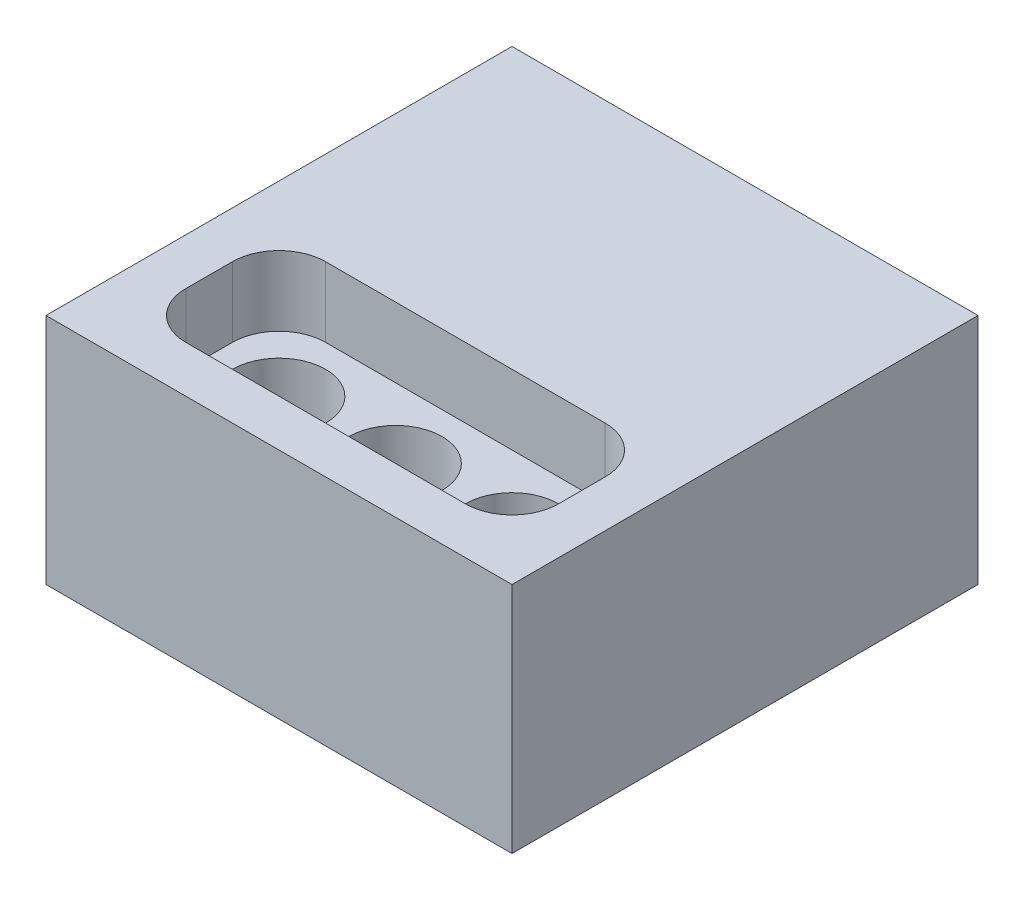
ISO-10303-21;
HEADER;
FILE_DESCRIPTION(('STEP AP214'),'2;1');
FILE_NAME('part.step','',(''),(''),'','','');
FILE_SCHEMA(('AUTOMOTIVE_DESIGN { 1 0 10303 214 1 1 1 1 }'));
ENDSEC;
DATA;
#1=APPLICATION_CONTEXT('core data for automotive mechanical design processes');
#2=APPLICATION_PROTOCOL_DEFINITION('international standard','automotive_design',2000,#1);
#3=PRODUCT_CONTEXT('',#1,'mechanical');
#4=PRODUCT('Part','Part','',(#3));
#5=PRODUCT_RELATED_PRODUCT_CATEGORY('part','',(#4));
#6=PRODUCT_DEFINITION_FORMATION('','',#4);
#7=PRODUCT_DEFINITION_CONTEXT('part definition',#1,'design');
#8=PRODUCT_DEFINITION('design','',#6,#7);
#9=PRODUCT_DEFINITION_SHAPE('','',#8);
#10=(LENGTH_UNIT() NAMED_UNIT(*) SI_UNIT(.MILLI.,.METRE.));
#11=(NAMED_UNIT(*) PLANE_ANGLE_UNIT() SI_UNIT($,.RADIAN.));
#12=(NAMED_UNIT(*) SI_UNIT($,.STERADIAN.) SOLID_ANGLE_UNIT());
#13=UNCERTAINTY_MEASURE_WITH_UNIT(LENGTH_MEASURE(1.E-05),#10,'distance_accuracy_value','');
#14=(GEOMETRIC_REPRESENTATION_CONTEXT(3) GLOBAL_UNCERTAINTY_ASSIGNED_CONTEXT((#13)) GLOBAL_UNIT_ASSIGNED_CONTEXT((#10,
#11,#12)) REPRESENTATION_CONTEXT('',''));
#15=CARTESIAN_POINT('',(0.,0.,0.));
#16=DIRECTION('',(0.,0.,1.));
#17=DIRECTION('',(1.,0.,0.));
#18=AXIS2_PLACEMENT_3D('',#15,#16,#17);
#19=CARTESIAN_POINT('',(0.,50.,0.));
#20=DIRECTION('',(1.,0.,0.));
#21=DIRECTION('',(0.,0.,-1.));
#22=AXIS2_PLACEMENT_3D('',#19,#20,#21);
#23=PLANE('',#22);
#24=DIRECTION('',(0.,0.,1.));
#25=VECTOR('',#24,1.);
#26=CARTESIAN_POINT('',(0.,0.,0.));
#27=LINE('',#26,#25);
#28=CARTESIAN_POINT('',(0.,0.,-100.));
#29=VERTEX_POINT('',#28);
#30=CARTESIAN_POINT('',(0.,0.,0.));
#31=VERTEX_POINT('',#30);
#32=EDGE_CURVE('E143',#29,#31,#27,.T.);
#33=ORIENTED_EDGE('',*,*,#32,.T.);
#34=DIRECTION('',(0.,-1.,0.));
#35=VECTOR('',#34,1.);
#36=CARTESIAN_POINT('',(0.,50.,0.));
#37=LINE('',#36,#35);
#38=CARTESIAN_POINT('',(0.,50.,0.));
#39=VERTEX_POINT('',#38);
#40=EDGE_CURVE('E124',#39,#31,#37,.T.);
#41=ORIENTED_EDGE('',*,*,#40,.F.);
#42=DIRECTION('',(0.,0.,1.));
#43=VECTOR('',#42,1.);
#44=CARTESIAN_POINT('',(0.,50.,0.));
#45=LINE('',#44,#43);
#46=CARTESIAN_POINT('',(0.,50.,-100.));
#47=VERTEX_POINT('',#46);
#48=EDGE_CURVE('E131',#47,#39,#45,.T.);
#49=ORIENTED_EDGE('',*,*,#48,.F.);
#50=DIRECTION('',(0.,-1.,0.));
#51=VECTOR('',#50,1.);
#52=CARTESIAN_POINT('',(0.,50.,-100.));
#53=LINE('',#52,#51);
#54=EDGE_CURVE('E223',#47,#29,#53,.T.);
#55=ORIENTED_EDGE('',*,*,#54,.T.);
#56=EDGE_LOOP('',(#33,#41,#49,#55));
#57=FACE_BOUND('',#56,.T.);
#58=ADVANCED_FACE('F32',(#57),#23,.F.);
#59=CARTESIAN_POINT('',(0.,50.,0.));
#60=DIRECTION('',(0.,0.,-1.));
#61=DIRECTION('',(-1.,0.,0.));
#62=AXIS2_PLACEMENT_3D('',#59,#60,#61);
#63=PLANE('',#62);
#64=DIRECTION('',(1.,0.,0.));
#65=VECTOR('',#64,1.);
#66=CARTESIAN_POINT('',(0.,0.,0.));
#67=LINE('',#66,#65);
#68=CARTESIAN_POINT('',(100.,0.,0.));
#69=VERTEX_POINT('',#68);
#70=EDGE_CURVE('E225',#31,#69,#67,.T.);
#71=ORIENTED_EDGE('',*,*,#70,.T.);
#72=DIRECTION('',(0.,-1.,0.));
#73=VECTOR('',#72,1.);
#74=CARTESIAN_POINT('',(100.,50.,0.));
#75=LINE('',#74,#73);
#76=CARTESIAN_POINT('',(100.,50.,0.));
#77=VERTEX_POINT('',#76);
#78=EDGE_CURVE('E127',#77,#69,#75,.T.);
#79=ORIENTED_EDGE('',*,*,#78,.F.);
#80=DIRECTION('',(1.,0.,0.));
#81=VECTOR('',#80,1.);
#82=CARTESIAN_POINT('',(0.,50.,0.));
#83=LINE('',#82,#81);
#84=EDGE_CURVE('E120',#39,#77,#83,.T.);
#85=ORIENTED_EDGE('',*,*,#84,.F.);
#86=ORIENTED_EDGE('',*,*,#40,.T.);
#87=EDGE_LOOP('',(#71,#79,#85,#86));
#88=FACE_BOUND('',#87,.T.);
#89=ADVANCED_FACE('F122',(#88),#63,.F.);
#90=CARTESIAN_POINT('',(100.,50.,0.));
#91=DIRECTION('',(-1.,0.,0.));
#92=DIRECTION('',(0.,0.,1.));
#93=AXIS2_PLACEMENT_3D('',#90,#91,#92);
#94=PLANE('',#93);
#95=DIRECTION('',(0.,0.,-1.));
#96=VECTOR('',#95,1.);
#97=CARTESIAN_POINT('',(100.,0.,0.));
#98=LINE('',#97,#96);
#99=CARTESIAN_POINT('',(100.,0.,-100.));
#100=VERTEX_POINT('',#99);
#101=EDGE_CURVE('E227',#69,#100,#98,.T.);
#102=ORIENTED_EDGE('',*,*,#101,.T.);
#103=DIRECTION('',(0.,-1.,0.));
#104=VECTOR('',#103,1.);
#105=CARTESIAN_POINT('',(100.,50.,-100.));
#106=LINE('',#105,#104);
#107=CARTESIAN_POINT('',(100.,50.,-100.));
#108=VERTEX_POINT('',#107);
#109=EDGE_CURVE('E148',#108,#100,#106,.T.);
#110=ORIENTED_EDGE('',*,*,#109,.F.);
#111=DIRECTION('',(0.,0.,-1.));
#112=VECTOR('',#111,1.);
#113=CARTESIAN_POINT('',(100.,50.,0.));
#114=LINE('',#113,#112);
#115=EDGE_CURVE('E130',#77,#108,#114,.T.);
#116=ORIENTED_EDGE('',*,*,#115,.F.);
#117=ORIENTED_EDGE('',*,*,#78,.T.);
#118=EDGE_LOOP('',(#102,#110,#116,#117));
#119=FACE_BOUND('',#118,.T.);
#120=ADVANCED_FACE('F239',(#119),#94,.F.);
#121=CARTESIAN_POINT('',(0.,50.,-100.));
#122=DIRECTION('',(0.,0.,1.));
#123=DIRECTION('',(1.,0.,0.));
#124=AXIS2_PLACEMENT_3D('',#121,#122,#123);
#125=PLANE('',#124);
#126=DIRECTION('',(-1.,0.,0.));
#127=VECTOR('',#126,1.);
#128=CARTESIAN_POINT('',(0.,0.,-100.));
#129=LINE('',#128,#127);
#130=EDGE_CURVE('E140',#100,#29,#129,.T.);
#131=ORIENTED_EDGE('',*,*,#130,.T.);
#132=ORIENTED_EDGE('',*,*,#54,.F.);
#133=DIRECTION('',(-1.,0.,0.));
#134=VECTOR('',#133,1.);
#135=CARTESIAN_POINT('',(0.,50.,-100.));
#136=LINE('',#135,#134);
#137=EDGE_CURVE('E136',#108,#47,#136,.T.);
#138=ORIENTED_EDGE('',*,*,#137,.F.);
#139=ORIENTED_EDGE('',*,*,#109,.T.);
#140=EDGE_LOOP('',(#131,#132,#138,#139));
#141=FACE_BOUND('',#140,.T.);
#142=ADVANCED_FACE('F234',(#141),#125,.F.);
#143=CARTESIAN_POINT('',(0.,50.,0.));
#144=DIRECTION('',(0.,-1.,0.));
#145=DIRECTION('',(0.,0.,-1.));
#146=AXIS2_PLACEMENT_3D('',#143,#144,#145);
#147=PLANE('',#146);
#148=DIRECTION('',(1.,0.,0.));
#149=VECTOR('',#148,1.);
#150=CARTESIAN_POINT('',(10.,50.,-10.));
#151=LINE('',#150,#149);
#152=CARTESIAN_POINT('',(20.,50.,-10.));
#153=VERTEX_POINT('',#152);
#154=CARTESIAN_POINT('',(80.,50.,-10.));
#155=VERTEX_POINT('',#154);
#156=EDGE_CURVE('E215',#153,#155,#151,.T.);
#157=ORIENTED_EDGE('',*,*,#156,.F.);
#158=CARTESIAN_POINT('',(20.,50.,-20.));
#159=DIRECTION('',(0.,-1.,0.));
#160=DIRECTION('',(0.,0.,-1.));
#161=AXIS2_PLACEMENT_3D('',#158,#159,#160);
#162=CIRCLE('',#161,10.);
#163=CARTESIAN_POINT('',(10.,50.,-20.));
#164=VERTEX_POINT('',#163);
#165=EDGE_CURVE('E11',#153,#164,#162,.T.);
#166=ORIENTED_EDGE('',*,*,#165,.T.);
#167=DIRECTION('',(0.,0.,1.));
#168=VECTOR('',#167,1.);
#169=CARTESIAN_POINT('',(10.,50.,-10.));
#170=LINE('',#169,#168);
#171=CARTESIAN_POINT('',(10.,50.,-30.));
#172=VERTEX_POINT('',#171);
#173=EDGE_CURVE('E182',#172,#164,#170,.T.);
#174=ORIENTED_EDGE('',*,*,#173,.F.);
#175=CARTESIAN_POINT('',(20.,50.,-30.));
#176=DIRECTION('',(0.,-1.,0.));
#177=DIRECTION('',(0.,0.,-1.));
#178=AXIS2_PLACEMENT_3D('',#175,#176,#177);
#179=CIRCLE('',#178,10.);
#180=CARTESIAN_POINT('',(20.,50.,-40.));
#181=VERTEX_POINT('',#180);
#182=EDGE_CURVE('E40',#172,#181,#179,.T.);
#183=ORIENTED_EDGE('',*,*,#182,.T.);
#184=DIRECTION('',(-1.,0.,0.));
#185=VECTOR('',#184,1.);
#186=CARTESIAN_POINT('',(10.,50.,-40.));
#187=LINE('',#186,#185);
#188=CARTESIAN_POINT('',(80.,50.,-40.));
#189=VERTEX_POINT('',#188);
#190=EDGE_CURVE('E181',#189,#181,#187,.T.);
#191=ORIENTED_EDGE('',*,*,#190,.F.);
#192=CARTESIAN_POINT('',(80.,50.,-30.));
#193=DIRECTION('',(0.,-1.,0.));
#194=DIRECTION('',(0.,0.,-1.));
#195=AXIS2_PLACEMENT_3D('',#192,#193,#194);
#196=CIRCLE('',#195,10.);
#197=CARTESIAN_POINT('',(90.,50.,-30.));
#198=VERTEX_POINT('',#197);
#199=EDGE_CURVE('E178',#189,#198,#196,.T.);
#200=ORIENTED_EDGE('',*,*,#199,.T.);
#201=DIRECTION('',(0.,0.,-1.));
#202=VECTOR('',#201,1.);
#203=CARTESIAN_POINT('',(90.,50.,-10.));
#204=LINE('',#203,#202);
#205=CARTESIAN_POINT('',(90.,50.,-20.));
#206=VERTEX_POINT('',#205);
#207=EDGE_CURVE('E189',#206,#198,#204,.T.);
#208=ORIENTED_EDGE('',*,*,#207,.F.);
#209=CARTESIAN_POINT('',(80.,50.,-20.));
#210=DIRECTION('',(0.,-1.,0.));
#211=DIRECTION('',(0.,0.,-1.));
#212=AXIS2_PLACEMENT_3D('',#209,#210,#211);
#213=CIRCLE('',#212,10.);
#214=EDGE_CURVE('E176',#206,#155,#213,.T.);
#215=ORIENTED_EDGE('',*,*,#214,.T.);
#216=EDGE_LOOP('',(#157,#166,#174,#183,#191,#200,#208,#215));
#217=FACE_BOUND('',#216,.T.);
#218=ORIENTED_EDGE('',*,*,#48,.T.);
#219=ORIENTED_EDGE('',*,*,#84,.T.);
#220=ORIENTED_EDGE('',*,*,#115,.T.);
#221=ORIENTED_EDGE('',*,*,#137,.T.);
#222=EDGE_LOOP('',(#218,#219,#220,#221));
#223=FACE_BOUND('',#222,.T.);
#224=ADVANCED_FACE('F134',(#217,#223),#147,.F.);
#225=CARTESIAN_POINT('',(0.,0.,0.));
#226=DIRECTION('',(0.,-1.,0.));
#227=DIRECTION('',(0.,0.,-1.));
#228=AXIS2_PLACEMENT_3D('',#225,#226,#227);
#229=PLANE('',#228);
#230=CARTESIAN_POINT('',(50.,0.,-25.));
#231=DIRECTION('',(0.,1.,0.));
#232=DIRECTION('',(0.,0.,1.));
#233=AXIS2_PLACEMENT_3D('',#230,#231,#232);
#234=CIRCLE('',#233,10.);
#235=CARTESIAN_POINT('',(50.,0.,-15.));
#236=VERTEX_POINT('',#235);
#237=EDGE_CURVE('E305',#236,#236,#234,.T.);
#238=ORIENTED_EDGE('',*,*,#237,.T.);
#239=EDGE_LOOP('',(#238));
#240=FACE_BOUND('',#239,.T.);
#241=ORIENTED_EDGE('',*,*,#32,.F.);
#242=ORIENTED_EDGE('',*,*,#130,.F.);
#243=ORIENTED_EDGE('',*,*,#101,.F.);
#244=ORIENTED_EDGE('',*,*,#70,.F.);
#245=EDGE_LOOP('',(#241,#242,#243,#244));
#246=FACE_BOUND('',#245,.T.);
#247=ADVANCED_FACE('F238',(#240,#246),#229,.T.);
#248=CARTESIAN_POINT('',(10.,35.,-10.));
#249=DIRECTION('',(-1.,0.,0.));
#250=DIRECTION('',(0.,0.,1.));
#251=AXIS2_PLACEMENT_3D('',#248,#249,#250);
#252=PLANE('',#251);
#253=DIRECTION('',(0.,0.,1.));
#254=VECTOR('',#253,1.);
#255=CARTESIAN_POINT('',(10.,35.,-10.));
#256=LINE('',#255,#254);
#257=CARTESIAN_POINT('',(10.,35.,-30.));
#258=VERTEX_POINT('',#257);
#259=CARTESIAN_POINT('',(10.,35.,-20.));
#260=VERTEX_POINT('',#259);
#261=EDGE_CURVE('E188',#258,#260,#256,.T.);
#262=ORIENTED_EDGE('',*,*,#261,.F.);
#263=DIRECTION('',(0.,1.,0.));
#264=VECTOR('',#263,1.);
#265=CARTESIAN_POINT('',(10.,50.,-30.));
#266=LINE('',#265,#264);
#267=EDGE_CURVE('E174',#258,#172,#266,.T.);
#268=ORIENTED_EDGE('',*,*,#267,.T.);
#269=ORIENTED_EDGE('',*,*,#173,.T.);
#270=DIRECTION('',(0.,1.,0.));
#271=VECTOR('',#270,1.);
#272=CARTESIAN_POINT('',(10.,35.,-20.));
#273=LINE('',#272,#271);
#274=EDGE_CURVE('E172',#164,#260,#273,.F.);
#275=ORIENTED_EDGE('',*,*,#274,.T.);
#276=EDGE_LOOP('',(#262,#268,#269,#275));
#277=FACE_BOUND('',#276,.T.);
#278=ADVANCED_FACE('F201',(#277),#252,.F.);
#279=CARTESIAN_POINT('',(10.,35.,-40.));
#280=DIRECTION('',(0.,0.,-1.));
#281=DIRECTION('',(-1.,0.,0.));
#282=AXIS2_PLACEMENT_3D('',#279,#280,#281);
#283=PLANE('',#282);
#284=DIRECTION('',(-1.,0.,0.));
#285=VECTOR('',#284,1.);
#286=CARTESIAN_POINT('',(10.,35.,-40.));
#287=LINE('',#286,#285);
#288=CARTESIAN_POINT('',(80.,35.,-40.));
#289=VERTEX_POINT('',#288);
#290=CARTESIAN_POINT('',(20.,35.,-40.));
#291=VERTEX_POINT('',#290);
#292=EDGE_CURVE('E199',#289,#291,#287,.T.);
#293=ORIENTED_EDGE('',*,*,#292,.F.);
#294=DIRECTION('',(0.,1.,0.));
#295=VECTOR('',#294,1.);
#296=CARTESIAN_POINT('',(80.,50.,-40.));
#297=LINE('',#296,#295);
#298=EDGE_CURVE('E169',#289,#189,#297,.T.);
#299=ORIENTED_EDGE('',*,*,#298,.T.);
#300=ORIENTED_EDGE('',*,*,#190,.T.);
#301=DIRECTION('',(0.,1.,0.));
#302=VECTOR('',#301,1.);
#303=CARTESIAN_POINT('',(20.,35.,-40.));
#304=LINE('',#303,#302);
#305=EDGE_CURVE('E167',#181,#291,#304,.F.);
#306=ORIENTED_EDGE('',*,*,#305,.T.);
#307=EDGE_LOOP('',(#293,#299,#300,#306));
#308=FACE_BOUND('',#307,.T.);
#309=ADVANCED_FACE('F185',(#308),#283,.F.);
#310=CARTESIAN_POINT('',(90.,35.,-10.));
#311=DIRECTION('',(1.,0.,0.));
#312=DIRECTION('',(0.,0.,-1.));
#313=AXIS2_PLACEMENT_3D('',#310,#311,#312);
#314=PLANE('',#313);
#315=DIRECTION('',(0.,0.,-1.));
#316=VECTOR('',#315,1.);
#317=CARTESIAN_POINT('',(90.,35.,-10.));
#318=LINE('',#317,#316);
#319=CARTESIAN_POINT('',(90.,35.,-20.));
#320=VERTEX_POINT('',#319);
#321=CARTESIAN_POINT('',(90.,35.,-30.));
#322=VERTEX_POINT('',#321);
#323=EDGE_CURVE('E205',#320,#322,#318,.T.);
#324=ORIENTED_EDGE('',*,*,#323,.F.);
#325=DIRECTION('',(0.,1.,0.));
#326=VECTOR('',#325,1.);
#327=CARTESIAN_POINT('',(90.,50.,-20.));
#328=LINE('',#327,#326);
#329=EDGE_CURVE('E146',#320,#206,#328,.T.);
#330=ORIENTED_EDGE('',*,*,#329,.T.);
#331=ORIENTED_EDGE('',*,*,#207,.T.);
#332=DIRECTION('',(0.,1.,0.));
#333=VECTOR('',#332,1.);
#334=CARTESIAN_POINT('',(90.,35.,-30.));
#335=LINE('',#334,#333);
#336=EDGE_CURVE('E144',#198,#322,#335,.F.);
#337=ORIENTED_EDGE('',*,*,#336,.T.);
#338=EDGE_LOOP('',(#324,#330,#331,#337));
#339=FACE_BOUND('',#338,.T.);
#340=ADVANCED_FACE('F282',(#339),#314,.F.);
#341=CARTESIAN_POINT('',(10.,35.,-10.));
#342=DIRECTION('',(0.,0.,1.));
#343=DIRECTION('',(1.,0.,0.));
#344=AXIS2_PLACEMENT_3D('',#341,#342,#343);
#345=PLANE('',#344);
#346=ORIENTED_EDGE('',*,*,#156,.T.);
#347=DIRECTION('',(0.,1.,0.));
#348=VECTOR('',#347,1.);
#349=CARTESIAN_POINT('',(80.,35.,-10.));
#350=LINE('',#349,#348);
#351=CARTESIAN_POINT('',(80.,35.,-10.));
#352=VERTEX_POINT('',#351);
#353=EDGE_CURVE('E157',#155,#352,#350,.F.);
#354=ORIENTED_EDGE('',*,*,#353,.T.);
#355=DIRECTION('',(1.,0.,0.));
#356=VECTOR('',#355,1.);
#357=CARTESIAN_POINT('',(10.,35.,-10.));
#358=LINE('',#357,#356);
#359=CARTESIAN_POINT('',(20.,35.,-10.));
#360=VERTEX_POINT('',#359);
#361=EDGE_CURVE('E203',#360,#352,#358,.T.);
#362=ORIENTED_EDGE('',*,*,#361,.F.);
#363=DIRECTION('',(0.,1.,0.));
#364=VECTOR('',#363,1.);
#365=CARTESIAN_POINT('',(20.,50.,-10.));
#366=LINE('',#365,#364);
#367=EDGE_CURVE('E154',#360,#153,#366,.T.);
#368=ORIENTED_EDGE('',*,*,#367,.T.);
#369=EDGE_LOOP('',(#346,#354,#362,#368));
#370=FACE_BOUND('',#369,.T.);
#371=ADVANCED_FACE('F276',(#370),#345,.F.);
#372=CARTESIAN_POINT('',(0.,35.,0.));
#373=DIRECTION('',(0.,-1.,0.));
#374=DIRECTION('',(0.,0.,-1.));
#375=AXIS2_PLACEMENT_3D('',#372,#373,#374);
#376=PLANE('',#375);
#377=CARTESIAN_POINT('',(50.,35.,-25.));
#378=DIRECTION('',(0.,1.,0.));
#379=DIRECTION('',(0.,0.,1.));
#380=AXIS2_PLACEMENT_3D('',#377,#378,#379);
#381=CIRCLE('',#380,10.);
#382=CARTESIAN_POINT('',(50.,35.,-15.));
#383=VERTEX_POINT('',#382);
#384=EDGE_CURVE('E307',#383,#383,#381,.T.);
#385=ORIENTED_EDGE('',*,*,#384,.F.);
#386=EDGE_LOOP('',(#385));
#387=FACE_BOUND('',#386,.T.);
#388=CARTESIAN_POINT('',(25.,35.,-25.));
#389=DIRECTION('',(0.,1.,0.));
#390=DIRECTION('',(0.,0.,1.));
#391=AXIS2_PLACEMENT_3D('',#388,#389,#390);
#392=CIRCLE('',#391,10.);
#393=CARTESIAN_POINT('',(25.,35.,-15.));
#394=VERTEX_POINT('',#393);
#395=EDGE_CURVE('E316',#394,#394,#392,.T.);
#396=ORIENTED_EDGE('',*,*,#395,.F.);
#397=EDGE_LOOP('',(#396));
#398=FACE_BOUND('',#397,.T.);
#399=CARTESIAN_POINT('',(75.,35.,-25.));
#400=DIRECTION('',(0.,1.,0.));
#401=DIRECTION('',(0.,0.,1.));
#402=AXIS2_PLACEMENT_3D('',#399,#400,#401);
#403=CIRCLE('',#402,9.99999999999999);
#404=CARTESIAN_POINT('',(75.,35.,-15.));
#405=VERTEX_POINT('',#404);
#406=EDGE_CURVE('E208',#405,#405,#403,.T.);
#407=ORIENTED_EDGE('',*,*,#406,.F.);
#408=EDGE_LOOP('',(#407));
#409=FACE_BOUND('',#408,.T.);
#410=ORIENTED_EDGE('',*,*,#361,.T.);
#411=CARTESIAN_POINT('',(80.,35.,-20.));
#412=DIRECTION('',(0.,-1.,0.));
#413=DIRECTION('',(0.,0.,-1.));
#414=AXIS2_PLACEMENT_3D('',#411,#412,#413);
#415=CIRCLE('',#414,10.);
#416=EDGE_CURVE('E165',#352,#320,#415,.F.);
#417=ORIENTED_EDGE('',*,*,#416,.T.);
#418=ORIENTED_EDGE('',*,*,#323,.T.);
#419=CARTESIAN_POINT('',(80.,35.,-30.));
#420=DIRECTION('',(0.,-1.,0.));
#421=DIRECTION('',(0.,0.,-1.));
#422=AXIS2_PLACEMENT_3D('',#419,#420,#421);
#423=CIRCLE('',#422,10.);
#424=EDGE_CURVE('E163',#322,#289,#423,.F.);
#425=ORIENTED_EDGE('',*,*,#424,.T.);
#426=ORIENTED_EDGE('',*,*,#292,.T.);
#427=CARTESIAN_POINT('',(20.,35.,-30.));
#428=DIRECTION('',(0.,-1.,0.));
#429=DIRECTION('',(0.,0.,-1.));
#430=AXIS2_PLACEMENT_3D('',#427,#428,#429);
#431=CIRCLE('',#430,10.);
#432=EDGE_CURVE('E161',#291,#258,#431,.F.);
#433=ORIENTED_EDGE('',*,*,#432,.T.);
#434=ORIENTED_EDGE('',*,*,#261,.T.);
#435=CARTESIAN_POINT('',(20.,35.,-20.));
#436=DIRECTION('',(0.,-1.,0.));
#437=DIRECTION('',(0.,0.,-1.));
#438=AXIS2_PLACEMENT_3D('',#435,#436,#437);
#439=CIRCLE('',#438,10.);
#440=EDGE_CURVE('E159',#260,#360,#439,.F.);
#441=ORIENTED_EDGE('',*,*,#440,.T.);
#442=EDGE_LOOP('',(#410,#417,#418,#425,#426,#433,#434,#441));
#443=FACE_BOUND('',#442,.T.);
#444=ADVANCED_FACE('F197',(#387,#398,#409,#443),#376,.F.);
#445=CARTESIAN_POINT('',(80.,35.,-20.));
#446=DIRECTION('',(0.,-1.,0.));
#447=DIRECTION('',(0.,0.,-1.));
#448=AXIS2_PLACEMENT_3D('',#445,#446,#447);
#449=CYLINDRICAL_SURFACE('',#448,10.);
#450=ORIENTED_EDGE('',*,*,#416,.F.);
#451=ORIENTED_EDGE('',*,*,#353,.F.);
#452=ORIENTED_EDGE('',*,*,#214,.F.);
#453=ORIENTED_EDGE('',*,*,#329,.F.);
#454=EDGE_LOOP('',(#450,#451,#452,#453));
#455=FACE_BOUND('',#454,.T.);
#456=ADVANCED_FACE('F253',(#455),#449,.F.);
#457=CARTESIAN_POINT('',(80.,35.,-30.));
#458=DIRECTION('',(0.,-1.,0.));
#459=DIRECTION('',(0.,0.,-1.));
#460=AXIS2_PLACEMENT_3D('',#457,#458,#459);
#461=CYLINDRICAL_SURFACE('',#460,10.);
#462=ORIENTED_EDGE('',*,*,#424,.F.);
#463=ORIENTED_EDGE('',*,*,#336,.F.);
#464=ORIENTED_EDGE('',*,*,#199,.F.);
#465=ORIENTED_EDGE('',*,*,#298,.F.);
#466=EDGE_LOOP('',(#462,#463,#464,#465));
#467=FACE_BOUND('',#466,.T.);
#468=ADVANCED_FACE('F256',(#467),#461,.F.);
#469=CARTESIAN_POINT('',(20.,35.,-30.));
#470=DIRECTION('',(0.,-1.,0.));
#471=DIRECTION('',(0.,0.,-1.));
#472=AXIS2_PLACEMENT_3D('',#469,#470,#471);
#473=CYLINDRICAL_SURFACE('',#472,10.);
#474=ORIENTED_EDGE('',*,*,#432,.F.);
#475=ORIENTED_EDGE('',*,*,#305,.F.);
#476=ORIENTED_EDGE('',*,*,#182,.F.);
#477=ORIENTED_EDGE('',*,*,#267,.F.);
#478=EDGE_LOOP('',(#474,#475,#476,#477));
#479=FACE_BOUND('',#478,.T.);
#480=ADVANCED_FACE('F192',(#479),#473,.F.);
#481=CARTESIAN_POINT('',(20.,35.,-20.));
#482=DIRECTION('',(0.,-1.,0.));
#483=DIRECTION('',(0.,0.,-1.));
#484=AXIS2_PLACEMENT_3D('',#481,#482,#483);
#485=CYLINDRICAL_SURFACE('',#484,10.);
#486=ORIENTED_EDGE('',*,*,#440,.F.);
#487=ORIENTED_EDGE('',*,*,#274,.F.);
#488=ORIENTED_EDGE('',*,*,#165,.F.);
#489=ORIENTED_EDGE('',*,*,#367,.F.);
#490=EDGE_LOOP('',(#486,#487,#488,#489));
#491=FACE_BOUND('',#490,.T.);
#492=ADVANCED_FACE('F34',(#491),#485,.F.);
#493=CARTESIAN_POINT('',(75.,20.,-25.));
#494=DIRECTION('',(0.,1.,0.));
#495=DIRECTION('',(0.,0.,1.));
#496=AXIS2_PLACEMENT_3D('',#493,#494,#495);
#497=CYLINDRICAL_SURFACE('',#496,9.99999999999999);
#498=CARTESIAN_POINT('',(75.,20.,-25.));
#499=DIRECTION('',(0.,1.,0.));
#500=DIRECTION('',(0.,0.,1.));
#501=AXIS2_PLACEMENT_3D('',#498,#499,#500);
#502=CIRCLE('',#501,9.99999999999999);
#503=CARTESIAN_POINT('',(75.,20.,-15.));
#504=VERTEX_POINT('',#503);
#505=EDGE_CURVE('E310',#504,#504,#502,.T.);
#506=ORIENTED_EDGE('',*,*,#505,.F.);
#507=EDGE_LOOP('',(#506));
#508=FACE_BOUND('',#507,.T.);
#509=ORIENTED_EDGE('',*,*,#406,.T.);
#510=EDGE_LOOP('',(#509));
#511=FACE_BOUND('',#510,.T.);
#512=ADVANCED_FACE('F264',(#508,#511),#497,.F.);
#513=CARTESIAN_POINT('',(75.,20.,-25.));
#514=DIRECTION('',(0.,1.,0.));
#515=DIRECTION('',(0.,0.,1.));
#516=AXIS2_PLACEMENT_3D('',#513,#514,#515);
#517=PLANE('',#516);
#518=ORIENTED_EDGE('',*,*,#505,.T.);
#519=EDGE_LOOP('',(#518));
#520=FACE_BOUND('',#519,.T.);
#521=ADVANCED_FACE('F269',(#520),#517,.T.);
#522=CARTESIAN_POINT('',(25.,20.,-25.));
#523=DIRECTION('',(0.,1.,0.));
#524=DIRECTION('',(0.,0.,1.));
#525=AXIS2_PLACEMENT_3D('',#522,#523,#524);
#526=CYLINDRICAL_SURFACE('',#525,10.);
#527=CARTESIAN_POINT('',(25.,20.,-25.));
#528=DIRECTION('',(0.,1.,0.));
#529=DIRECTION('',(0.,0.,1.));
#530=AXIS2_PLACEMENT_3D('',#527,#528,#529);
#531=CIRCLE('',#530,10.);
#532=CARTESIAN_POINT('',(25.,20.,-15.));
#533=VERTEX_POINT('',#532);
#534=EDGE_CURVE('E216',#533,#533,#531,.T.);
#535=ORIENTED_EDGE('',*,*,#534,.F.);
#536=EDGE_LOOP('',(#535));
#537=FACE_BOUND('',#536,.T.);
#538=ORIENTED_EDGE('',*,*,#395,.T.);
#539=EDGE_LOOP('',(#538));
#540=FACE_BOUND('',#539,.T.);
#541=ADVANCED_FACE('F333',(#537,#540),#526,.F.);
#542=CARTESIAN_POINT('',(25.,20.,-25.));
#543=DIRECTION('',(0.,1.,0.));
#544=DIRECTION('',(0.,0.,1.));
#545=AXIS2_PLACEMENT_3D('',#542,#543,#544);
#546=PLANE('',#545);
#547=ORIENTED_EDGE('',*,*,#534,.T.);
#548=EDGE_LOOP('',(#547));
#549=FACE_BOUND('',#548,.T.);
#550=ADVANCED_FACE('F336',(#549),#546,.T.);
#551=CARTESIAN_POINT('',(50.,0.,-25.));
#552=DIRECTION('',(0.,1.,0.));
#553=DIRECTION('',(0.,0.,1.));
#554=AXIS2_PLACEMENT_3D('',#551,#552,#553);
#555=CYLINDRICAL_SURFACE('',#554,10.);
#556=ORIENTED_EDGE('',*,*,#237,.F.);
#557=EDGE_LOOP('',(#556));
#558=FACE_BOUND('',#557,.T.);
#559=ORIENTED_EDGE('',*,*,#384,.T.);
#560=EDGE_LOOP('',(#559));
#561=FACE_BOUND('',#560,.T.);
#562=ADVANCED_FACE('F340',(#558,#561),#555,.F.);
#563=CLOSED_SHELL('',(#58,#89,#120,#142,#224,#247,#278,#309,#340,#371,#444,#456,#468,#480,#492,
#512,#521,#541,#550,#562));
#564=MANIFOLD_SOLID_BREP('B2',#563);
#565=ADVANCED_BREP_SHAPE_REPRESENTATION('',(#18,#564),#14);
#566=SHAPE_DEFINITION_REPRESENTATION(#9,#565);
ENDSEC;
END-ISO-10303-21;
